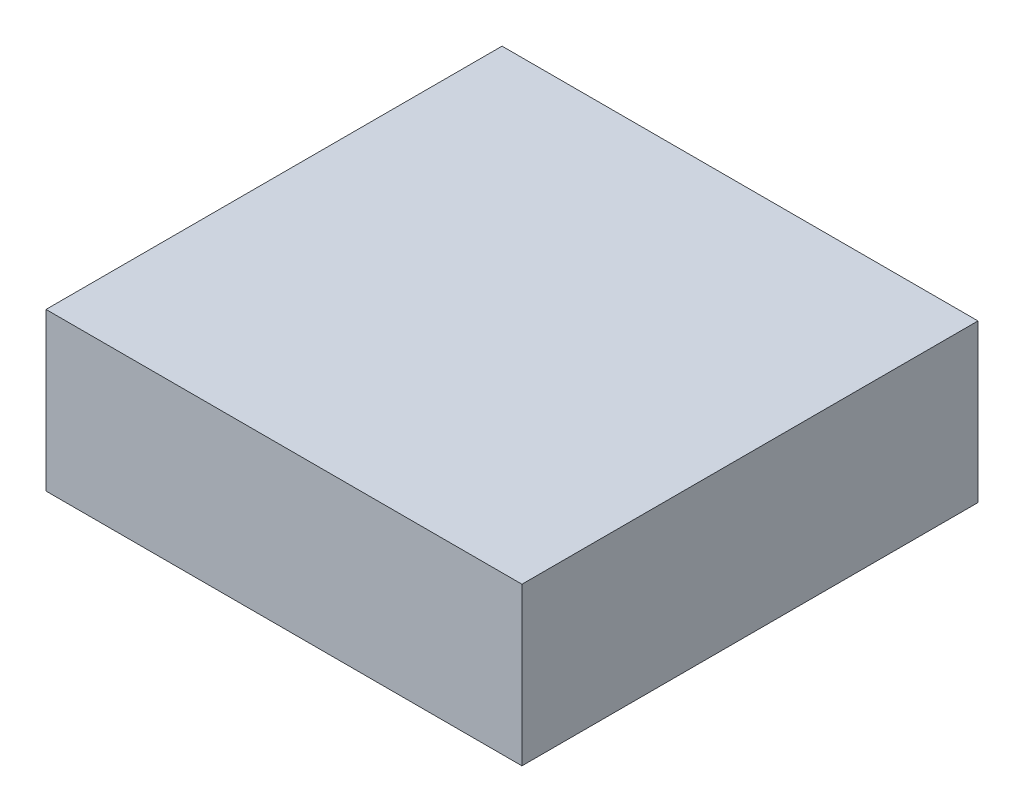
ISO-10303-21;
HEADER;
FILE_DESCRIPTION(('STEP AP214'),'2;1');
FILE_NAME('part.step','',(''),(''),'','','');
FILE_SCHEMA(('AUTOMOTIVE_DESIGN { 1 0 10303 214 1 1 1 1 }'));
ENDSEC;
DATA;
#1=APPLICATION_CONTEXT('core data for automotive mechanical design processes');
#2=APPLICATION_PROTOCOL_DEFINITION('international standard','automotive_design',2000,#1);
#3=PRODUCT_CONTEXT('',#1,'mechanical');
#4=PRODUCT('Part','Part','',(#3));
#5=PRODUCT_RELATED_PRODUCT_CATEGORY('part','',(#4));
#6=PRODUCT_DEFINITION_FORMATION('','',#4);
#7=PRODUCT_DEFINITION_CONTEXT('part definition',#1,'design');
#8=PRODUCT_DEFINITION('design','',#6,#7);
#9=PRODUCT_DEFINITION_SHAPE('','',#8);
#10=(LENGTH_UNIT() NAMED_UNIT(*) SI_UNIT(.MILLI.,.METRE.));
#11=(NAMED_UNIT(*) PLANE_ANGLE_UNIT() SI_UNIT($,.RADIAN.));
#12=(NAMED_UNIT(*) SI_UNIT($,.STERADIAN.) SOLID_ANGLE_UNIT());
#13=UNCERTAINTY_MEASURE_WITH_UNIT(LENGTH_MEASURE(1.E-05),#10,'distance_accuracy_value','');
#14=(GEOMETRIC_REPRESENTATION_CONTEXT(3) GLOBAL_UNCERTAINTY_ASSIGNED_CONTEXT((#13)) GLOBAL_UNIT_ASSIGNED_CONTEXT((#10,
#11,#12)) REPRESENTATION_CONTEXT('',''));
#15=CARTESIAN_POINT('',(0.,0.,0.));
#16=DIRECTION('',(0.,0.,1.));
#17=DIRECTION('',(1.,0.,0.));
#18=AXIS2_PLACEMENT_3D('',#15,#16,#17);
#19=CARTESIAN_POINT('',(11.95,7.9,-11.45));
#20=DIRECTION('',(-1.,0.,0.));
#21=DIRECTION('',(0.,0.,1.));
#22=AXIS2_PLACEMENT_3D('',#19,#20,#21);
#23=PLANE('',#22);
#24=DIRECTION('',(0.,0.,-1.));
#25=VECTOR('',#24,1.);
#26=CARTESIAN_POINT('',(11.95,0.,-11.45));
#27=LINE('',#26,#25);
#28=CARTESIAN_POINT('',(11.95,0.,11.45));
#29=VERTEX_POINT('',#28);
#30=CARTESIAN_POINT('',(11.95,0.,-11.45));
#31=VERTEX_POINT('',#30);
#32=EDGE_CURVE('E93',#29,#31,#27,.T.);
#33=ORIENTED_EDGE('',*,*,#32,.T.);
#34=DIRECTION('',(0.,-1.,0.));
#35=VECTOR('',#34,1.);
#36=CARTESIAN_POINT('',(11.95,7.9,-11.45));
#37=LINE('',#36,#35);
#38=CARTESIAN_POINT('',(11.95,7.9,-11.45));
#39=VERTEX_POINT('',#38);
#40=EDGE_CURVE('E11',#39,#31,#37,.T.);
#41=ORIENTED_EDGE('',*,*,#40,.F.);
#42=DIRECTION('',(0.,0.,-1.));
#43=VECTOR('',#42,1.);
#44=CARTESIAN_POINT('',(11.95,7.9,-11.45));
#45=LINE('',#44,#43);
#46=CARTESIAN_POINT('',(11.95,7.9,11.45));
#47=VERTEX_POINT('',#46);
#48=EDGE_CURVE('E81',#47,#39,#45,.T.);
#49=ORIENTED_EDGE('',*,*,#48,.F.);
#50=DIRECTION('',(0.,-1.,0.));
#51=VECTOR('',#50,1.);
#52=CARTESIAN_POINT('',(11.95,7.9,11.45));
#53=LINE('',#52,#51);
#54=EDGE_CURVE('E89',#47,#29,#53,.T.);
#55=ORIENTED_EDGE('',*,*,#54,.T.);
#56=EDGE_LOOP('',(#33,#41,#49,#55));
#57=FACE_BOUND('',#56,.T.);
#58=ADVANCED_FACE('F30',(#57),#23,.F.);
#59=CARTESIAN_POINT('',(-11.95,7.9,-11.45));
#60=DIRECTION('',(0.,0.,1.));
#61=DIRECTION('',(1.,0.,0.));
#62=AXIS2_PLACEMENT_3D('',#59,#60,#61);
#63=PLANE('',#62);
#64=DIRECTION('',(-1.,0.,0.));
#65=VECTOR('',#64,1.);
#66=CARTESIAN_POINT('',(-11.95,0.,-11.45));
#67=LINE('',#66,#65);
#68=CARTESIAN_POINT('',(-11.95,0.,-11.45));
#69=VERTEX_POINT('',#68);
#70=EDGE_CURVE('E85',#31,#69,#67,.T.);
#71=ORIENTED_EDGE('',*,*,#70,.T.);
#72=DIRECTION('',(0.,-1.,0.));
#73=VECTOR('',#72,1.);
#74=CARTESIAN_POINT('',(-11.95,7.9,-11.45));
#75=LINE('',#74,#73);
#76=CARTESIAN_POINT('',(-11.95,7.9,-11.45));
#77=VERTEX_POINT('',#76);
#78=EDGE_CURVE('E38',#77,#69,#75,.T.);
#79=ORIENTED_EDGE('',*,*,#78,.F.);
#80=DIRECTION('',(-1.,0.,0.));
#81=VECTOR('',#80,1.);
#82=CARTESIAN_POINT('',(-11.95,7.9,-11.45));
#83=LINE('',#82,#81);
#84=EDGE_CURVE('E76',#39,#77,#83,.T.);
#85=ORIENTED_EDGE('',*,*,#84,.F.);
#86=ORIENTED_EDGE('',*,*,#40,.T.);
#87=EDGE_LOOP('',(#71,#79,#85,#86));
#88=FACE_BOUND('',#87,.T.);
#89=ADVANCED_FACE('F84',(#88),#63,.F.);
#90=CARTESIAN_POINT('',(-11.95,7.9,-11.45));
#91=DIRECTION('',(1.,0.,0.));
#92=DIRECTION('',(0.,0.,-1.));
#93=AXIS2_PLACEMENT_3D('',#90,#91,#92);
#94=PLANE('',#93);
#95=DIRECTION('',(0.,0.,1.));
#96=VECTOR('',#95,1.);
#97=CARTESIAN_POINT('',(-11.95,0.,-11.45));
#98=LINE('',#97,#96);
#99=CARTESIAN_POINT('',(-11.95,0.,11.45));
#100=VERTEX_POINT('',#99);
#101=EDGE_CURVE('E63',#69,#100,#98,.T.);
#102=ORIENTED_EDGE('',*,*,#101,.T.);
#103=DIRECTION('',(0.,-1.,0.));
#104=VECTOR('',#103,1.);
#105=CARTESIAN_POINT('',(-11.95,7.9,11.45));
#106=LINE('',#105,#104);
#107=CARTESIAN_POINT('',(-11.95,7.9,11.45));
#108=VERTEX_POINT('',#107);
#109=EDGE_CURVE('E86',#108,#100,#106,.T.);
#110=ORIENTED_EDGE('',*,*,#109,.F.);
#111=DIRECTION('',(0.,0.,1.));
#112=VECTOR('',#111,1.);
#113=CARTESIAN_POINT('',(-11.95,7.9,-11.45));
#114=LINE('',#113,#112);
#115=EDGE_CURVE('E79',#77,#108,#114,.T.);
#116=ORIENTED_EDGE('',*,*,#115,.F.);
#117=ORIENTED_EDGE('',*,*,#78,.T.);
#118=EDGE_LOOP('',(#102,#110,#116,#117));
#119=FACE_BOUND('',#118,.T.);
#120=ADVANCED_FACE('F87',(#119),#94,.F.);
#121=CARTESIAN_POINT('',(-11.95,7.9,11.45));
#122=DIRECTION('',(0.,0.,-1.));
#123=DIRECTION('',(-1.,0.,0.));
#124=AXIS2_PLACEMENT_3D('',#121,#122,#123);
#125=PLANE('',#124);
#126=DIRECTION('',(1.,0.,0.));
#127=VECTOR('',#126,1.);
#128=CARTESIAN_POINT('',(-11.95,0.,11.45));
#129=LINE('',#128,#127);
#130=EDGE_CURVE('E69',#100,#29,#129,.T.);
#131=ORIENTED_EDGE('',*,*,#130,.T.);
#132=ORIENTED_EDGE('',*,*,#54,.F.);
#133=DIRECTION('',(1.,0.,0.));
#134=VECTOR('',#133,1.);
#135=CARTESIAN_POINT('',(-11.95,7.9,11.45));
#136=LINE('',#135,#134);
#137=EDGE_CURVE('E46',#108,#47,#136,.T.);
#138=ORIENTED_EDGE('',*,*,#137,.F.);
#139=ORIENTED_EDGE('',*,*,#109,.T.);
#140=EDGE_LOOP('',(#131,#132,#138,#139));
#141=FACE_BOUND('',#140,.T.);
#142=ADVANCED_FACE('F100',(#141),#125,.F.);
#143=CARTESIAN_POINT('',(11.95,7.9,11.45));
#144=DIRECTION('',(0.,1.,0.));
#145=DIRECTION('',(0.,0.,1.));
#146=AXIS2_PLACEMENT_3D('',#143,#144,#145);
#147=PLANE('',#146);
#148=ORIENTED_EDGE('',*,*,#48,.T.);
#149=ORIENTED_EDGE('',*,*,#84,.T.);
#150=ORIENTED_EDGE('',*,*,#115,.T.);
#151=ORIENTED_EDGE('',*,*,#137,.T.);
#152=EDGE_LOOP('',(#148,#149,#150,#151));
#153=FACE_BOUND('',#152,.T.);
#154=ADVANCED_FACE('F77',(#153),#147,.T.);
#155=CARTESIAN_POINT('',(11.95,0.,11.45));
#156=DIRECTION('',(0.,1.,0.));
#157=DIRECTION('',(0.,0.,1.));
#158=AXIS2_PLACEMENT_3D('',#155,#156,#157);
#159=PLANE('',#158);
#160=ORIENTED_EDGE('',*,*,#32,.F.);
#161=ORIENTED_EDGE('',*,*,#130,.F.);
#162=ORIENTED_EDGE('',*,*,#101,.F.);
#163=ORIENTED_EDGE('',*,*,#70,.F.);
#164=EDGE_LOOP('',(#160,#161,#162,#163));
#165=FACE_BOUND('',#164,.T.);
#166=ADVANCED_FACE('F103',(#165),#159,.F.);
#167=CLOSED_SHELL('',(#58,#89,#120,#142,#154,#166));
#168=MANIFOLD_SOLID_BREP('B2',#167);
#169=ADVANCED_BREP_SHAPE_REPRESENTATION('',(#18,#168),#14);
#170=SHAPE_DEFINITION_REPRESENTATION(#9,#169);
ENDSEC;
END-ISO-10303-21;
